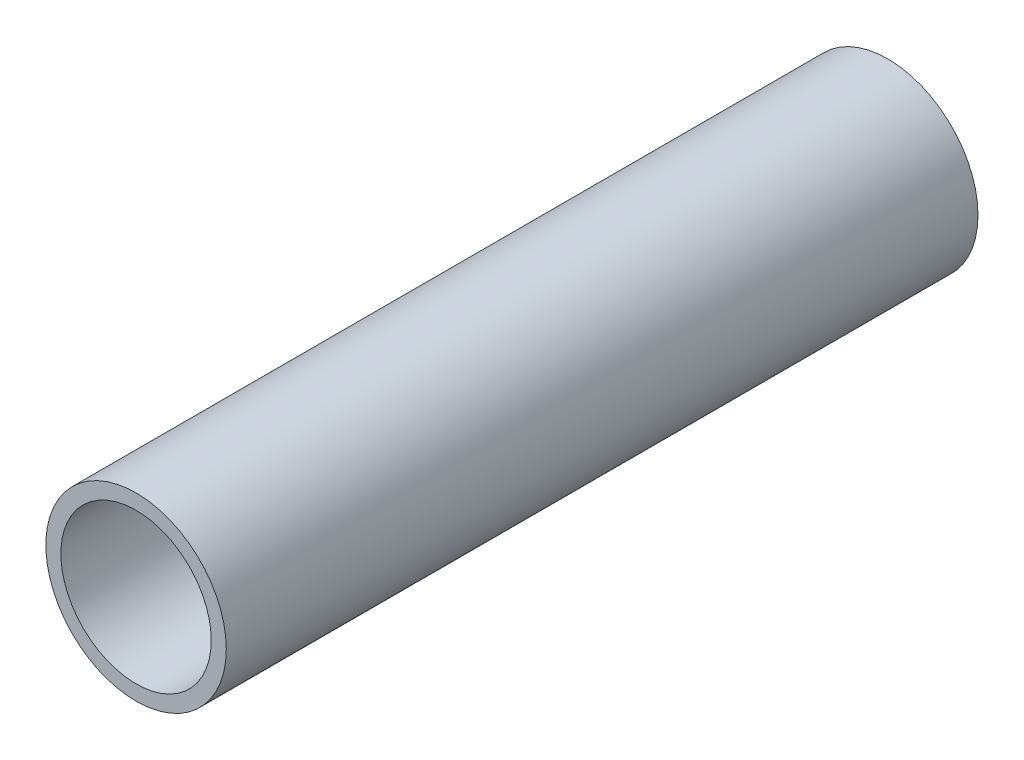
ISO-10303-21;
HEADER;
FILE_DESCRIPTION(('STEP AP214'),'2;1');
FILE_NAME('part.step','',(''),(''),'','','');
FILE_SCHEMA(('AUTOMOTIVE_DESIGN { 1 0 10303 214 1 1 1 1 }'));
ENDSEC;
DATA;
#1=APPLICATION_CONTEXT('core data for automotive mechanical design processes');
#2=APPLICATION_PROTOCOL_DEFINITION('international standard','automotive_design',2000,#1);
#3=PRODUCT_CONTEXT('',#1,'mechanical');
#4=PRODUCT('Part','Part','',(#3));
#5=PRODUCT_RELATED_PRODUCT_CATEGORY('part','',(#4));
#6=PRODUCT_DEFINITION_FORMATION('','',#4);
#7=PRODUCT_DEFINITION_CONTEXT('part definition',#1,'design');
#8=PRODUCT_DEFINITION('design','',#6,#7);
#9=PRODUCT_DEFINITION_SHAPE('','',#8);
#10=(LENGTH_UNIT() NAMED_UNIT(*) SI_UNIT(.MILLI.,.METRE.));
#11=(NAMED_UNIT(*) PLANE_ANGLE_UNIT() SI_UNIT($,.RADIAN.));
#12=(NAMED_UNIT(*) SI_UNIT($,.STERADIAN.) SOLID_ANGLE_UNIT());
#13=UNCERTAINTY_MEASURE_WITH_UNIT(LENGTH_MEASURE(1.E-05),#10,'distance_accuracy_value','');
#14=(GEOMETRIC_REPRESENTATION_CONTEXT(3) GLOBAL_UNCERTAINTY_ASSIGNED_CONTEXT((#13)) GLOBAL_UNIT_ASSIGNED_CONTEXT((#10,
#11,#12)) REPRESENTATION_CONTEXT('',''));
#15=CARTESIAN_POINT('',(0.,0.,0.));
#16=DIRECTION('',(0.,0.,1.));
#17=DIRECTION('',(1.,0.,0.));
#18=AXIS2_PLACEMENT_3D('',#15,#16,#17);
#19=CARTESIAN_POINT('',(0.,0.,249.95));
#20=DIRECTION('',(0.,0.,1.));
#21=DIRECTION('',(1.,0.,0.));
#22=AXIS2_PLACEMENT_3D('',#19,#20,#21);
#23=PLANE('',#22);
#24=CARTESIAN_POINT('',(0.,0.,249.95));
#25=DIRECTION('',(0.,0.,1.));
#26=DIRECTION('',(1.,0.,0.));
#27=AXIS2_PLACEMENT_3D('',#24,#25,#26);
#28=CIRCLE('',#27,60.);
#29=CARTESIAN_POINT('',(60.,0.,249.95));
#30=VERTEX_POINT('',#29);
#31=EDGE_CURVE('E10',#30,#30,#28,.T.);
#32=ORIENTED_EDGE('',*,*,#31,.T.);
#33=EDGE_LOOP('',(#32));
#34=FACE_BOUND('',#33,.T.);
#35=CARTESIAN_POINT('',(0.,0.,249.95));
#36=DIRECTION('',(0.,0.,1.));
#37=DIRECTION('',(1.,0.,0.));
#38=AXIS2_PLACEMENT_3D('',#35,#36,#37);
#39=CIRCLE('',#38,50.);
#40=CARTESIAN_POINT('',(50.,0.,249.95));
#41=VERTEX_POINT('',#40);
#42=EDGE_CURVE('E50',#41,#41,#39,.T.);
#43=ORIENTED_EDGE('',*,*,#42,.F.);
#44=EDGE_LOOP('',(#43));
#45=FACE_BOUND('',#44,.T.);
#46=ADVANCED_FACE('F39',(#34,#45),#23,.T.);
#47=CARTESIAN_POINT('',(0.,0.,-249.95));
#48=DIRECTION('',(0.,0.,1.));
#49=DIRECTION('',(1.,0.,0.));
#50=AXIS2_PLACEMENT_3D('',#47,#48,#49);
#51=PLANE('',#50);
#52=CARTESIAN_POINT('',(0.,0.,-249.95));
#53=DIRECTION('',(0.,0.,1.));
#54=DIRECTION('',(1.,0.,0.));
#55=AXIS2_PLACEMENT_3D('',#52,#53,#54);
#56=CIRCLE('',#55,60.);
#57=CARTESIAN_POINT('',(60.,0.,-249.95));
#58=VERTEX_POINT('',#57);
#59=EDGE_CURVE('E43',#58,#58,#56,.T.);
#60=ORIENTED_EDGE('',*,*,#59,.F.);
#61=EDGE_LOOP('',(#60));
#62=FACE_BOUND('',#61,.T.);
#63=CARTESIAN_POINT('',(0.,0.,-249.95));
#64=DIRECTION('',(0.,0.,1.));
#65=DIRECTION('',(1.,0.,0.));
#66=AXIS2_PLACEMENT_3D('',#63,#64,#65);
#67=CIRCLE('',#66,50.);
#68=CARTESIAN_POINT('',(50.,0.,-249.95));
#69=VERTEX_POINT('',#68);
#70=EDGE_CURVE('E52',#69,#69,#67,.T.);
#71=ORIENTED_EDGE('',*,*,#70,.T.);
#72=EDGE_LOOP('',(#71));
#73=FACE_BOUND('',#72,.T.);
#74=ADVANCED_FACE('F62',(#62,#73),#51,.F.);
#75=CARTESIAN_POINT('',(0.,0.,249.95));
#76=DIRECTION('',(0.,0.,-1.));
#77=DIRECTION('',(-1.,0.,0.));
#78=AXIS2_PLACEMENT_3D('',#75,#76,#77);
#79=CYLINDRICAL_SURFACE('',#78,60.);
#80=ORIENTED_EDGE('',*,*,#31,.F.);
#81=EDGE_LOOP('',(#80));
#82=FACE_BOUND('',#81,.T.);
#83=ORIENTED_EDGE('',*,*,#59,.T.);
#84=EDGE_LOOP('',(#83));
#85=FACE_BOUND('',#84,.T.);
#86=ADVANCED_FACE('F41',(#82,#85),#79,.T.);
#87=CARTESIAN_POINT('',(0.,0.,249.95));
#88=DIRECTION('',(0.,0.,-1.));
#89=DIRECTION('',(-1.,0.,0.));
#90=AXIS2_PLACEMENT_3D('',#87,#88,#89);
#91=CYLINDRICAL_SURFACE('',#90,50.);
#92=ORIENTED_EDGE('',*,*,#42,.T.);
#93=EDGE_LOOP('',(#92));
#94=FACE_BOUND('',#93,.T.);
#95=ORIENTED_EDGE('',*,*,#70,.F.);
#96=EDGE_LOOP('',(#95));
#97=FACE_BOUND('',#96,.T.);
#98=ADVANCED_FACE('F58',(#94,#97),#91,.F.);
#99=CLOSED_SHELL('',(#46,#74,#86,#98));
#100=MANIFOLD_SOLID_BREP('B2',#99);
#101=ADVANCED_BREP_SHAPE_REPRESENTATION('',(#18,#100),#14);
#102=SHAPE_DEFINITION_REPRESENTATION(#9,#101);
ENDSEC;
END-ISO-10303-21;
